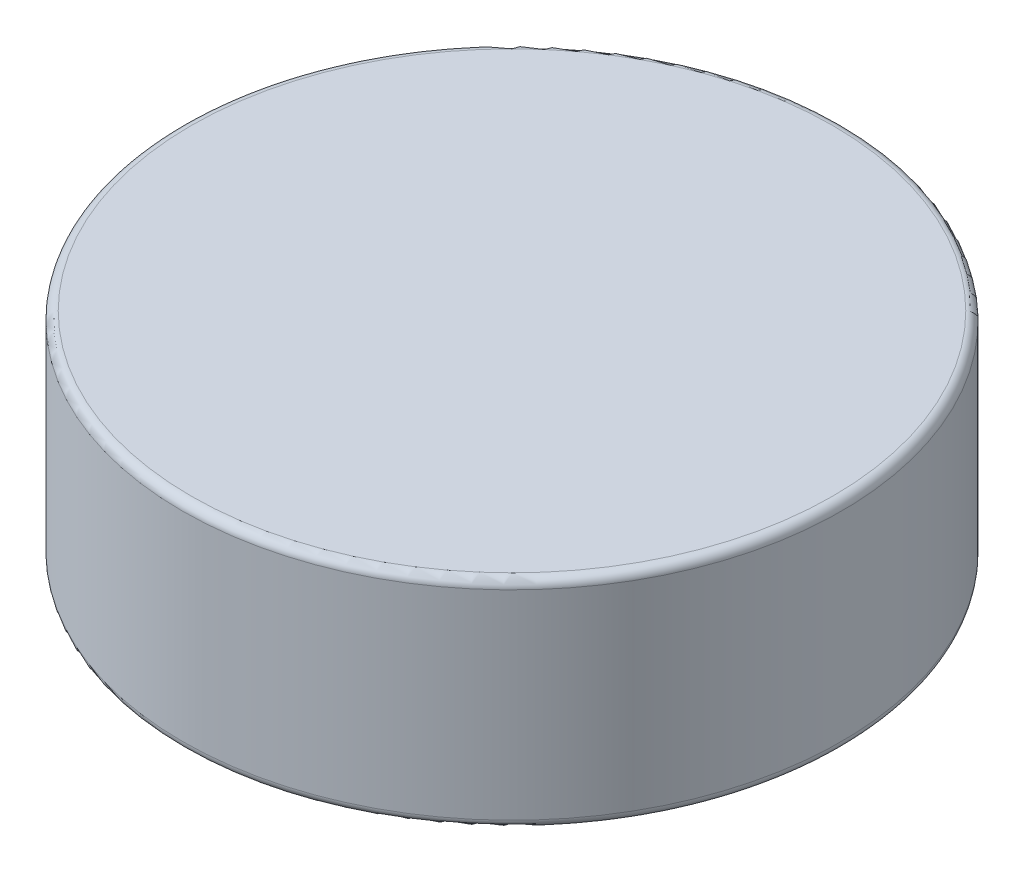
ISO-10303-21;
HEADER;
FILE_DESCRIPTION(('STEP AP214'),'2;1');
FILE_NAME('part.step','',(''),(''),'','','');
FILE_SCHEMA(('AUTOMOTIVE_DESIGN { 1 0 10303 214 1 1 1 1 }'));
ENDSEC;
DATA;
#1=APPLICATION_CONTEXT('core data for automotive mechanical design processes');
#2=APPLICATION_PROTOCOL_DEFINITION('international standard','automotive_design',2000,#1);
#3=PRODUCT_CONTEXT('',#1,'mechanical');
#4=PRODUCT('Part','Part','',(#3));
#5=PRODUCT_RELATED_PRODUCT_CATEGORY('part','',(#4));
#6=PRODUCT_DEFINITION_FORMATION('','',#4);
#7=PRODUCT_DEFINITION_CONTEXT('part definition',#1,'design');
#8=PRODUCT_DEFINITION('design','',#6,#7);
#9=PRODUCT_DEFINITION_SHAPE('','',#8);
#10=(LENGTH_UNIT() NAMED_UNIT(*) SI_UNIT(.MILLI.,.METRE.));
#11=(NAMED_UNIT(*) PLANE_ANGLE_UNIT() SI_UNIT($,.RADIAN.));
#12=(NAMED_UNIT(*) SI_UNIT($,.STERADIAN.) SOLID_ANGLE_UNIT());
#13=UNCERTAINTY_MEASURE_WITH_UNIT(LENGTH_MEASURE(1.E-05),#10,'distance_accuracy_value','');
#14=(GEOMETRIC_REPRESENTATION_CONTEXT(3) GLOBAL_UNCERTAINTY_ASSIGNED_CONTEXT((#13)) GLOBAL_UNIT_ASSIGNED_CONTEXT((#10,
#11,#12)) REPRESENTATION_CONTEXT('',''));
#15=CARTESIAN_POINT('',(0.,0.,0.));
#16=DIRECTION('',(0.,0.,1.));
#17=DIRECTION('',(1.,0.,0.));
#18=AXIS2_PLACEMENT_3D('',#15,#16,#17);
#19=CARTESIAN_POINT('',(-37.01,25.,37.7502));
#20=DIRECTION('',(0.,1.,0.));
#21=DIRECTION('',(1.,0.,0.));
#22=AXIS2_PLACEMENT_3D('',#19,#20,#21);
#23=PLANE('',#22);
#24=CARTESIAN_POINT('',(0.,25.,0.));
#25=DIRECTION('',(0.,1.,0.));
#26=DIRECTION('',(0.,0.,1.));
#27=AXIS2_PLACEMENT_3D('',#24,#25,#26);
#28=CIRCLE('',#27,37.);
#29=CARTESIAN_POINT('',(0.,25.,37.));
#30=VERTEX_POINT('',#29);
#31=EDGE_CURVE('E19',#30,#30,#28,.F.);
#32=ORIENTED_EDGE('',*,*,#31,.F.);
#33=EDGE_LOOP('',(#32));
#34=FACE_BOUND('',#33,.T.);
#35=ADVANCED_FACE('F15',(#34),#23,.T.);
#36=CARTESIAN_POINT('',(0.,24.,0.));
#37=DIRECTION('',(0.,1.,0.));
#38=DIRECTION('',(0.,0.,1.));
#39=AXIS2_PLACEMENT_3D('',#36,#37,#38);
#40=TOROIDAL_SURFACE('',#39,37.,0.999999999999998);
#41=CARTESIAN_POINT('',(0.,24.,0.));
#42=DIRECTION('',(0.,-1.,0.));
#43=DIRECTION('',(0.,0.,-1.));
#44=AXIS2_PLACEMENT_3D('',#41,#42,#43);
#45=CIRCLE('',#44,38.);
#46=CARTESIAN_POINT('',(0.,24.,-38.));
#47=VERTEX_POINT('',#46);
#48=EDGE_CURVE('E27',#47,#47,#45,.T.);
#49=ORIENTED_EDGE('',*,*,#48,.F.);
#50=EDGE_LOOP('',(#49));
#51=FACE_BOUND('',#50,.T.);
#52=ORIENTED_EDGE('',*,*,#31,.T.);
#53=EDGE_LOOP('',(#52));
#54=FACE_BOUND('',#53,.T.);
#55=ADVANCED_FACE('F36',(#51,#54),#40,.T.);
#56=CARTESIAN_POINT('',(0.,24.,0.));
#57=DIRECTION('',(0.,-1.,0.));
#58=DIRECTION('',(0.,0.,-1.));
#59=AXIS2_PLACEMENT_3D('',#56,#57,#58);
#60=CYLINDRICAL_SURFACE('',#59,38.);
#61=CARTESIAN_POINT('',(0.,1.,0.));
#62=DIRECTION('',(0.,-1.,0.));
#63=DIRECTION('',(0.,0.,-1.));
#64=AXIS2_PLACEMENT_3D('',#61,#62,#63);
#65=CIRCLE('',#64,38.);
#66=CARTESIAN_POINT('',(0.,1.,-38.));
#67=VERTEX_POINT('',#66);
#68=EDGE_CURVE('E23',#67,#67,#65,.T.);
#69=ORIENTED_EDGE('',*,*,#68,.F.);
#70=EDGE_LOOP('',(#69));
#71=FACE_BOUND('',#70,.T.);
#72=ORIENTED_EDGE('',*,*,#48,.T.);
#73=EDGE_LOOP('',(#72));
#74=FACE_BOUND('',#73,.T.);
#75=ADVANCED_FACE('F44',(#71,#74),#60,.T.);
#76=CARTESIAN_POINT('',(37.7502,0.,37.7502));
#77=DIRECTION('',(0.,-1.,0.));
#78=DIRECTION('',(-1.,0.,0.));
#79=AXIS2_PLACEMENT_3D('',#76,#77,#78);
#80=PLANE('',#79);
#81=CARTESIAN_POINT('',(0.,0.,0.));
#82=DIRECTION('',(0.,1.,0.));
#83=DIRECTION('',(0.,0.,1.));
#84=AXIS2_PLACEMENT_3D('',#81,#82,#83);
#85=CIRCLE('',#84,37.);
#86=CARTESIAN_POINT('',(0.,0.,37.));
#87=VERTEX_POINT('',#86);
#88=EDGE_CURVE('E10',#87,#87,#85,.T.);
#89=ORIENTED_EDGE('',*,*,#88,.F.);
#90=EDGE_LOOP('',(#89));
#91=FACE_BOUND('',#90,.T.);
#92=ADVANCED_FACE('F48',(#91),#80,.T.);
#93=CARTESIAN_POINT('',(0.,1.,0.));
#94=DIRECTION('',(0.,1.,0.));
#95=DIRECTION('',(0.,0.,1.));
#96=AXIS2_PLACEMENT_3D('',#93,#94,#95);
#97=TOROIDAL_SURFACE('',#96,37.,1.);
#98=ORIENTED_EDGE('',*,*,#88,.T.);
#99=EDGE_LOOP('',(#98));
#100=FACE_BOUND('',#99,.T.);
#101=ORIENTED_EDGE('',*,*,#68,.T.);
#102=EDGE_LOOP('',(#101));
#103=FACE_BOUND('',#102,.T.);
#104=ADVANCED_FACE('F17',(#100,#103),#97,.T.);
#105=CLOSED_SHELL('',(#35,#55,#75,#92,#104));
#106=MANIFOLD_SOLID_BREP('B1',#105);
#107=ADVANCED_BREP_SHAPE_REPRESENTATION('',(#18,#106),#14);
#108=SHAPE_DEFINITION_REPRESENTATION(#9,#107);
ENDSEC;
END-ISO-10303-21;
